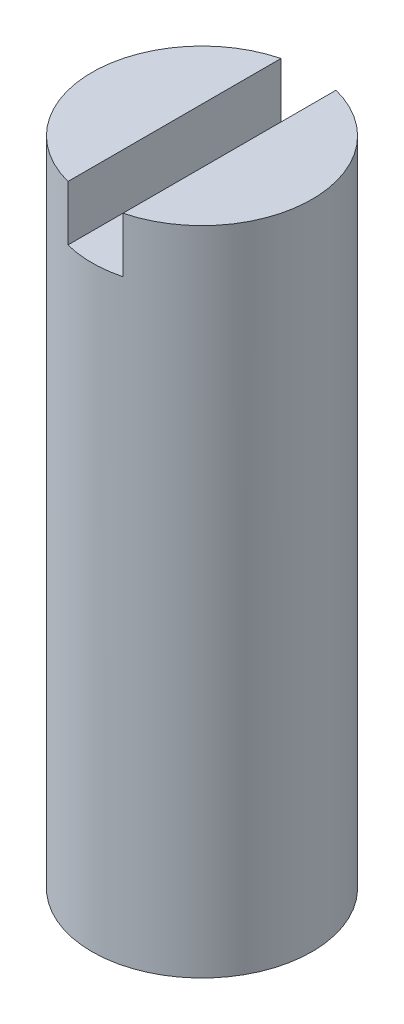
ISO-10303-21;
HEADER;
FILE_DESCRIPTION(('STEP AP214'),'2;1');
FILE_NAME('part.step','',(''),(''),'','','');
FILE_SCHEMA(('AUTOMOTIVE_DESIGN { 1 0 10303 214 1 1 1 1 }'));
ENDSEC;
DATA;
#1=APPLICATION_CONTEXT('core data for automotive mechanical design processes');
#2=APPLICATION_PROTOCOL_DEFINITION('international standard','automotive_design',2000,#1);
#3=PRODUCT_CONTEXT('',#1,'mechanical');
#4=PRODUCT('Part','Part','',(#3));
#5=PRODUCT_RELATED_PRODUCT_CATEGORY('part','',(#4));
#6=PRODUCT_DEFINITION_FORMATION('','',#4);
#7=PRODUCT_DEFINITION_CONTEXT('part definition',#1,'design');
#8=PRODUCT_DEFINITION('design','',#6,#7);
#9=PRODUCT_DEFINITION_SHAPE('','',#8);
#10=(LENGTH_UNIT() NAMED_UNIT(*) SI_UNIT(.MILLI.,.METRE.));
#11=(NAMED_UNIT(*) PLANE_ANGLE_UNIT() SI_UNIT($,.RADIAN.));
#12=(NAMED_UNIT(*) SI_UNIT($,.STERADIAN.) SOLID_ANGLE_UNIT());
#13=UNCERTAINTY_MEASURE_WITH_UNIT(LENGTH_MEASURE(1.E-05),#10,'distance_accuracy_value','');
#14=(GEOMETRIC_REPRESENTATION_CONTEXT(3) GLOBAL_UNCERTAINTY_ASSIGNED_CONTEXT((#13)) GLOBAL_UNIT_ASSIGNED_CONTEXT((#10,
#11,#12)) REPRESENTATION_CONTEXT('',''));
#15=CARTESIAN_POINT('',(0.,0.,0.));
#16=DIRECTION('',(0.,0.,1.));
#17=DIRECTION('',(1.,0.,0.));
#18=AXIS2_PLACEMENT_3D('',#15,#16,#17);
#19=CARTESIAN_POINT('',(0.,13.,0.));
#20=DIRECTION('',(0.,1.,0.));
#21=DIRECTION('',(0.,0.,1.));
#22=AXIS2_PLACEMENT_3D('',#19,#20,#21);
#23=PLANE('',#22);
#24=DIRECTION('',(0.,0.,1.));
#25=VECTOR('',#24,1.);
#26=CARTESIAN_POINT('',(-0.5,13.,0.));
#27=LINE('',#26,#25);
#28=CARTESIAN_POINT('',(-0.5,13.,-1.93649167310371));
#29=VERTEX_POINT('',#28);
#30=CARTESIAN_POINT('',(-0.5,13.,1.93649167310371));
#31=VERTEX_POINT('',#30);
#32=EDGE_CURVE('E83',#29,#31,#27,.T.);
#33=ORIENTED_EDGE('',*,*,#32,.F.);
#34=CARTESIAN_POINT('',(0.,13.,0.));
#35=DIRECTION('',(0.,1.,0.));
#36=DIRECTION('',(0.,0.,1.));
#37=AXIS2_PLACEMENT_3D('',#34,#35,#36);
#38=CIRCLE('',#37,2.);
#39=EDGE_CURVE('E96',#29,#31,#38,.T.);
#40=ORIENTED_EDGE('',*,*,#39,.T.);
#41=EDGE_LOOP('',(#33,#40));
#42=FACE_BOUND('',#41,.T.);
#43=ADVANCED_FACE('F37',(#42),#23,.T.);
#44=CARTESIAN_POINT('',(0.,13.,0.));
#45=DIRECTION('',(0.,-1.,0.));
#46=DIRECTION('',(0.,0.,-1.));
#47=AXIS2_PLACEMENT_3D('',#44,#45,#46);
#48=CYLINDRICAL_SURFACE('',#47,2.);
#49=ORIENTED_EDGE('',*,*,#39,.F.);
#50=DIRECTION('',(0.,-1.,0.));
#51=VECTOR('',#50,1.);
#52=CARTESIAN_POINT('',(-0.5,13.,-1.93649167310371));
#53=LINE('',#52,#51);
#54=CARTESIAN_POINT('',(-0.5,12.,-1.93649167310371));
#55=VERTEX_POINT('',#54);
#56=EDGE_CURVE('E101',#29,#55,#53,.T.);
#57=ORIENTED_EDGE('',*,*,#56,.T.);
#58=CARTESIAN_POINT('',(0.,12.,0.));
#59=DIRECTION('',(0.,1.,0.));
#60=DIRECTION('',(0.,0.,1.));
#61=AXIS2_PLACEMENT_3D('',#58,#59,#60);
#62=CIRCLE('',#61,2.);
#63=CARTESIAN_POINT('',(0.5,12.,-1.93649167310371));
#64=VERTEX_POINT('',#63);
#65=EDGE_CURVE('E11',#64,#55,#62,.T.);
#66=ORIENTED_EDGE('',*,*,#65,.F.);
#67=DIRECTION('',(0.,-1.,0.));
#68=VECTOR('',#67,1.);
#69=CARTESIAN_POINT('',(0.5,13.,-1.93649167310371));
#70=LINE('',#69,#68);
#71=CARTESIAN_POINT('',(0.5,13.,-1.93649167310371));
#72=VERTEX_POINT('',#71);
#73=EDGE_CURVE('E78',#64,#72,#70,.F.);
#74=ORIENTED_EDGE('',*,*,#73,.T.);
#75=CARTESIAN_POINT('',(0.5,13.,1.93649167310371));
#76=VERTEX_POINT('',#75);
#77=EDGE_CURVE('E91',#76,#72,#38,.T.);
#78=ORIENTED_EDGE('',*,*,#77,.F.);
#79=DIRECTION('',(0.,-1.,0.));
#80=VECTOR('',#79,1.);
#81=CARTESIAN_POINT('',(0.5,13.,1.93649167310371));
#82=LINE('',#81,#80);
#83=CARTESIAN_POINT('',(0.5,12.,1.93649167310371));
#84=VERTEX_POINT('',#83);
#85=EDGE_CURVE('E52',#76,#84,#82,.T.);
#86=ORIENTED_EDGE('',*,*,#85,.T.);
#87=CARTESIAN_POINT('',(-0.5,12.,1.93649167310371));
#88=VERTEX_POINT('',#87);
#89=EDGE_CURVE('E41',#88,#84,#62,.T.);
#90=ORIENTED_EDGE('',*,*,#89,.F.);
#91=DIRECTION('',(0.,-1.,0.));
#92=VECTOR('',#91,1.);
#93=CARTESIAN_POINT('',(-0.5,13.,1.93649167310371));
#94=LINE('',#93,#92);
#95=EDGE_CURVE('E114',#88,#31,#94,.F.);
#96=ORIENTED_EDGE('',*,*,#95,.T.);
#97=EDGE_LOOP('',(#49,#57,#66,#74,#78,#86,#90,#96));
#98=FACE_BOUND('',#97,.T.);
#99=CARTESIAN_POINT('',(0.,1.15470053837926,0.));
#100=DIRECTION('',(0.,1.,0.));
#101=DIRECTION('',(0.,0.,1.));
#102=AXIS2_PLACEMENT_3D('',#99,#100,#101);
#103=CIRCLE('',#102,2.);
#104=CARTESIAN_POINT('',(0.,1.15470053837926,2.));
#105=VERTEX_POINT('',#104);
#106=EDGE_CURVE('E84',#105,#105,#103,.T.);
#107=ORIENTED_EDGE('',*,*,#106,.T.);
#108=EDGE_LOOP('',(#107));
#109=FACE_BOUND('',#108,.T.);
#110=ADVANCED_FACE('F89',(#98,#109),#48,.T.);
#111=DIRECTION('',(0.,0.,-1.));
#112=VECTOR('',#111,1.);
#113=CARTESIAN_POINT('',(0.5,13.,0.));
#114=LINE('',#113,#112);
#115=EDGE_CURVE('E75',#76,#72,#114,.T.);
#116=ORIENTED_EDGE('',*,*,#115,.F.);
#117=ORIENTED_EDGE('',*,*,#77,.T.);
#118=EDGE_LOOP('',(#116,#117));
#119=FACE_BOUND('',#118,.T.);
#120=ADVANCED_FACE('F95',(#119),#23,.T.);
#121=CARTESIAN_POINT('',(0.,1.15470053837926,0.));
#122=DIRECTION('',(0.,1.,0.));
#123=DIRECTION('',(0.,0.,1.));
#124=AXIS2_PLACEMENT_3D('',#121,#122,#123);
#125=CONICAL_SURFACE('',#124,2.00000000000002,1.0471975511966);
#126=CARTESIAN_POINT('',(0.,0.,0.));
#127=VERTEX_POINT('',#126);
#128=VERTEX_LOOP('',#127);
#129=FACE_BOUND('',#128,.T.);
#130=ORIENTED_EDGE('',*,*,#106,.F.);
#131=EDGE_LOOP('',(#130));
#132=FACE_BOUND('',#131,.T.);
#133=ADVANCED_FACE('F39',(#129,#132),#125,.T.);
#134=CARTESIAN_POINT('',(0.,12.,0.));
#135=DIRECTION('',(0.,1.,0.));
#136=DIRECTION('',(0.,0.,1.));
#137=AXIS2_PLACEMENT_3D('',#134,#135,#136);
#138=PLANE('',#137);
#139=ORIENTED_EDGE('',*,*,#65,.T.);
#140=DIRECTION('',(0.,0.,1.));
#141=VECTOR('',#140,1.);
#142=CARTESIAN_POINT('',(-0.5,12.,-2.1509760027377));
#143=LINE('',#142,#141);
#144=EDGE_CURVE('E112',#55,#88,#143,.T.);
#145=ORIENTED_EDGE('',*,*,#144,.T.);
#146=ORIENTED_EDGE('',*,*,#89,.T.);
#147=DIRECTION('',(0.,0.,-1.));
#148=VECTOR('',#147,1.);
#149=CARTESIAN_POINT('',(0.5,12.,-2.1509760027377));
#150=LINE('',#149,#148);
#151=EDGE_CURVE('E93',#84,#64,#150,.T.);
#152=ORIENTED_EDGE('',*,*,#151,.T.);
#153=EDGE_LOOP('',(#139,#145,#146,#152));
#154=FACE_BOUND('',#153,.T.);
#155=ADVANCED_FACE('F110',(#154),#138,.T.);
#156=CARTESIAN_POINT('',(-0.5,12.,-2.1509760027377));
#157=DIRECTION('',(-1.,0.,0.));
#158=DIRECTION('',(0.,0.,1.));
#159=AXIS2_PLACEMENT_3D('',#156,#157,#158);
#160=PLANE('',#159);
#161=ORIENTED_EDGE('',*,*,#32,.T.);
#162=ORIENTED_EDGE('',*,*,#95,.F.);
#163=ORIENTED_EDGE('',*,*,#144,.F.);
#164=ORIENTED_EDGE('',*,*,#56,.F.);
#165=EDGE_LOOP('',(#161,#162,#163,#164));
#166=FACE_BOUND('',#165,.T.);
#167=ADVANCED_FACE('F117',(#166),#160,.F.);
#168=CARTESIAN_POINT('',(0.5,12.,-2.1509760027377));
#169=DIRECTION('',(1.,0.,0.));
#170=DIRECTION('',(0.,0.,-1.));
#171=AXIS2_PLACEMENT_3D('',#168,#169,#170);
#172=PLANE('',#171);
#173=ORIENTED_EDGE('',*,*,#115,.T.);
#174=ORIENTED_EDGE('',*,*,#73,.F.);
#175=ORIENTED_EDGE('',*,*,#151,.F.);
#176=ORIENTED_EDGE('',*,*,#85,.F.);
#177=EDGE_LOOP('',(#173,#174,#175,#176));
#178=FACE_BOUND('',#177,.T.);
#179=ADVANCED_FACE('F77',(#178),#172,.F.);
#180=CLOSED_SHELL('',(#43,#110,#120,#133,#155,#167,#179));
#181=MANIFOLD_SOLID_BREP('B2',#180);
#182=ADVANCED_BREP_SHAPE_REPRESENTATION('',(#18,#181),#14);
#183=SHAPE_DEFINITION_REPRESENTATION(#9,#182);
ENDSEC;
END-ISO-10303-21;
